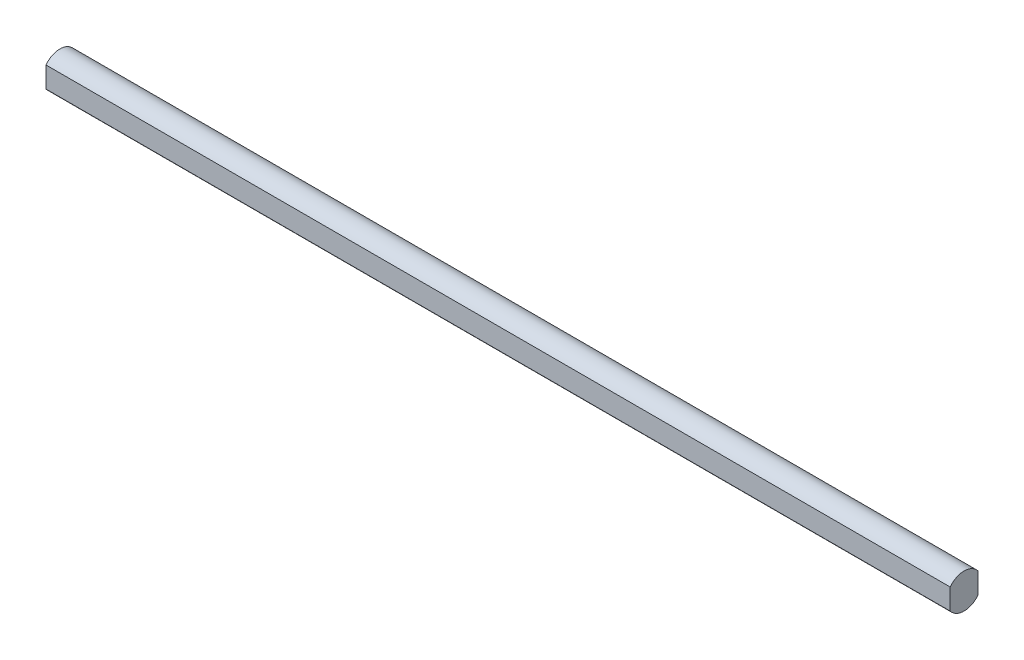
ISO-10303-21;
HEADER;
FILE_DESCRIPTION(('STEP AP214'),'2;1');
FILE_NAME('part.step','',(''),(''),'','','');
FILE_SCHEMA(('AUTOMOTIVE_DESIGN { 1 0 10303 214 1 1 1 1 }'));
ENDSEC;
DATA;
#1=APPLICATION_CONTEXT('core data for automotive mechanical design processes');
#2=APPLICATION_PROTOCOL_DEFINITION('international standard','automotive_design',2000,#1);
#3=PRODUCT_CONTEXT('',#1,'mechanical');
#4=PRODUCT('Part','Part','',(#3));
#5=PRODUCT_RELATED_PRODUCT_CATEGORY('part','',(#4));
#6=PRODUCT_DEFINITION_FORMATION('','',#4);
#7=PRODUCT_DEFINITION_CONTEXT('part definition',#1,'design');
#8=PRODUCT_DEFINITION('design','',#6,#7);
#9=PRODUCT_DEFINITION_SHAPE('','',#8);
#10=(LENGTH_UNIT() NAMED_UNIT(*) SI_UNIT(.MILLI.,.METRE.));
#11=(NAMED_UNIT(*) PLANE_ANGLE_UNIT() SI_UNIT($,.RADIAN.));
#12=(NAMED_UNIT(*) SI_UNIT($,.STERADIAN.) SOLID_ANGLE_UNIT());
#13=UNCERTAINTY_MEASURE_WITH_UNIT(LENGTH_MEASURE(1.E-05),#10,'distance_accuracy_value','');
#14=(GEOMETRIC_REPRESENTATION_CONTEXT(3) GLOBAL_UNCERTAINTY_ASSIGNED_CONTEXT((#13)) GLOBAL_UNIT_ASSIGNED_CONTEXT((#10,
#11,#12)) REPRESENTATION_CONTEXT('',''));
#15=CARTESIAN_POINT('',(0.,0.,0.));
#16=DIRECTION('',(0.,0.,1.));
#17=DIRECTION('',(1.,0.,0.));
#18=AXIS2_PLACEMENT_3D('',#15,#16,#17);
#19=CARTESIAN_POINT('',(65.,0.,0.));
#20=DIRECTION('',(-1.,0.,0.));
#21=DIRECTION('',(0.,0.,1.));
#22=AXIS2_PLACEMENT_3D('',#19,#20,#21);
#23=CYLINDRICAL_SURFACE('',#22,2.5);
#24=DIRECTION('',(-1.,0.,0.));
#25=VECTOR('',#24,1.);
#26=CARTESIAN_POINT('',(65.,-1.5,-2.));
#27=LINE('',#26,#25);
#28=CARTESIAN_POINT('',(65.,-1.5,-2.));
#29=VERTEX_POINT('',#28);
#30=CARTESIAN_POINT('',(-65.,-1.5,-2.));
#31=VERTEX_POINT('',#30);
#32=EDGE_CURVE('E52',#29,#31,#27,.T.);
#33=ORIENTED_EDGE('',*,*,#32,.F.);
#34=CARTESIAN_POINT('',(65.,0.,0.));
#35=DIRECTION('',(1.,0.,0.));
#36=DIRECTION('',(0.,0.,-1.));
#37=AXIS2_PLACEMENT_3D('',#34,#35,#36);
#38=CIRCLE('',#37,2.5);
#39=CARTESIAN_POINT('',(65.,-1.5,2.));
#40=VERTEX_POINT('',#39);
#41=EDGE_CURVE('E89',#40,#29,#38,.T.);
#42=ORIENTED_EDGE('',*,*,#41,.F.);
#43=DIRECTION('',(-1.,0.,0.));
#44=VECTOR('',#43,1.);
#45=CARTESIAN_POINT('',(65.,-1.5,2.));
#46=LINE('',#45,#44);
#47=CARTESIAN_POINT('',(-65.,-1.5,2.));
#48=VERTEX_POINT('',#47);
#49=EDGE_CURVE('E102',#40,#48,#46,.T.);
#50=ORIENTED_EDGE('',*,*,#49,.T.);
#51=CARTESIAN_POINT('',(-65.,0.,0.));
#52=DIRECTION('',(1.,0.,0.));
#53=DIRECTION('',(0.,0.,-1.));
#54=AXIS2_PLACEMENT_3D('',#51,#52,#53);
#55=CIRCLE('',#54,2.5);
#56=EDGE_CURVE('E91',#48,#31,#55,.T.);
#57=ORIENTED_EDGE('',*,*,#56,.T.);
#58=EDGE_LOOP('',(#33,#42,#50,#57));
#59=FACE_BOUND('',#58,.T.);
#60=ADVANCED_FACE('F39',(#59),#23,.T.);
#61=DIRECTION('',(-1.,0.,0.));
#62=VECTOR('',#61,1.);
#63=CARTESIAN_POINT('',(65.,1.5,-2.));
#64=LINE('',#63,#62);
#65=CARTESIAN_POINT('',(-65.,1.5,-2.));
#66=VERTEX_POINT('',#65);
#67=CARTESIAN_POINT('',(65.,1.5,-2.));
#68=VERTEX_POINT('',#67);
#69=EDGE_CURVE('E80',#66,#68,#64,.F.);
#70=ORIENTED_EDGE('',*,*,#69,.F.);
#71=CARTESIAN_POINT('',(-65.,1.5,2.));
#72=VERTEX_POINT('',#71);
#73=EDGE_CURVE('E60',#66,#72,#55,.T.);
#74=ORIENTED_EDGE('',*,*,#73,.T.);
#75=DIRECTION('',(-1.,0.,0.));
#76=VECTOR('',#75,1.);
#77=CARTESIAN_POINT('',(65.,1.5,2.));
#78=LINE('',#77,#76);
#79=CARTESIAN_POINT('',(65.,1.5,2.));
#80=VERTEX_POINT('',#79);
#81=EDGE_CURVE('E104',#72,#80,#78,.F.);
#82=ORIENTED_EDGE('',*,*,#81,.T.);
#83=EDGE_CURVE('E97',#68,#80,#38,.T.);
#84=ORIENTED_EDGE('',*,*,#83,.F.);
#85=EDGE_LOOP('',(#70,#74,#82,#84));
#86=FACE_BOUND('',#85,.T.);
#87=ADVANCED_FACE('F111',(#86),#23,.T.);
#88=CARTESIAN_POINT('',(65.,0.,0.));
#89=DIRECTION('',(1.,0.,0.));
#90=DIRECTION('',(0.,0.,-1.));
#91=AXIS2_PLACEMENT_3D('',#88,#89,#90);
#92=PLANE('',#91);
#93=ORIENTED_EDGE('',*,*,#41,.T.);
#94=DIRECTION('',(0.,1.,0.));
#95=VECTOR('',#94,1.);
#96=CARTESIAN_POINT('',(65.,-3.16132723234099,-2.));
#97=LINE('',#96,#95);
#98=EDGE_CURVE('E78',#29,#68,#97,.T.);
#99=ORIENTED_EDGE('',*,*,#98,.T.);
#100=ORIENTED_EDGE('',*,*,#83,.T.);
#101=DIRECTION('',(0.,1.,0.));
#102=VECTOR('',#101,1.);
#103=CARTESIAN_POINT('',(65.,-3.16132723234099,2.));
#104=LINE('',#103,#102);
#105=EDGE_CURVE('E92',#40,#80,#104,.T.);
#106=ORIENTED_EDGE('',*,*,#105,.F.);
#107=EDGE_LOOP('',(#93,#99,#100,#106));
#108=FACE_BOUND('',#107,.T.);
#109=ADVANCED_FACE('F95',(#108),#92,.T.);
#110=CARTESIAN_POINT('',(-65.,0.,0.));
#111=DIRECTION('',(1.,0.,0.));
#112=DIRECTION('',(0.,0.,-1.));
#113=AXIS2_PLACEMENT_3D('',#110,#111,#112);
#114=PLANE('',#113);
#115=DIRECTION('',(0.,1.,0.));
#116=VECTOR('',#115,1.);
#117=CARTESIAN_POINT('',(-65.,0.,-2.));
#118=LINE('',#117,#116);
#119=EDGE_CURVE('E11',#31,#66,#118,.T.);
#120=ORIENTED_EDGE('',*,*,#119,.F.);
#121=ORIENTED_EDGE('',*,*,#56,.F.);
#122=DIRECTION('',(0.,1.,0.));
#123=VECTOR('',#122,1.);
#124=CARTESIAN_POINT('',(-65.,0.,2.));
#125=LINE('',#124,#123);
#126=EDGE_CURVE('E46',#48,#72,#125,.T.);
#127=ORIENTED_EDGE('',*,*,#126,.T.);
#128=ORIENTED_EDGE('',*,*,#73,.F.);
#129=EDGE_LOOP('',(#120,#121,#127,#128));
#130=FACE_BOUND('',#129,.T.);
#131=ADVANCED_FACE('F110',(#130),#114,.F.);
#132=CARTESIAN_POINT('',(-65.,-3.16132723234099,2.));
#133=DIRECTION('',(0.,0.,-1.));
#134=DIRECTION('',(-1.,0.,0.));
#135=AXIS2_PLACEMENT_3D('',#132,#133,#134);
#136=PLANE('',#135);
#137=ORIENTED_EDGE('',*,*,#105,.T.);
#138=ORIENTED_EDGE('',*,*,#81,.F.);
#139=ORIENTED_EDGE('',*,*,#126,.F.);
#140=ORIENTED_EDGE('',*,*,#49,.F.);
#141=EDGE_LOOP('',(#137,#138,#139,#140));
#142=FACE_BOUND('',#141,.T.);
#143=ADVANCED_FACE('F108',(#142),#136,.F.);
#144=CARTESIAN_POINT('',(-65.,-3.16132723234099,-2.));
#145=DIRECTION('',(0.,0.,-1.));
#146=DIRECTION('',(-1.,0.,0.));
#147=AXIS2_PLACEMENT_3D('',#144,#145,#146);
#148=PLANE('',#147);
#149=ORIENTED_EDGE('',*,*,#32,.T.);
#150=ORIENTED_EDGE('',*,*,#119,.T.);
#151=ORIENTED_EDGE('',*,*,#69,.T.);
#152=ORIENTED_EDGE('',*,*,#98,.F.);
#153=EDGE_LOOP('',(#149,#150,#151,#152));
#154=FACE_BOUND('',#153,.T.);
#155=ADVANCED_FACE('F79',(#154),#148,.T.);
#156=CLOSED_SHELL('',(#60,#87,#109,#131,#143,#155));
#157=MANIFOLD_SOLID_BREP('B2',#156);
#158=ADVANCED_BREP_SHAPE_REPRESENTATION('',(#18,#157),#14);
#159=SHAPE_DEFINITION_REPRESENTATION(#9,#158);
ENDSEC;
END-ISO-10303-21;
